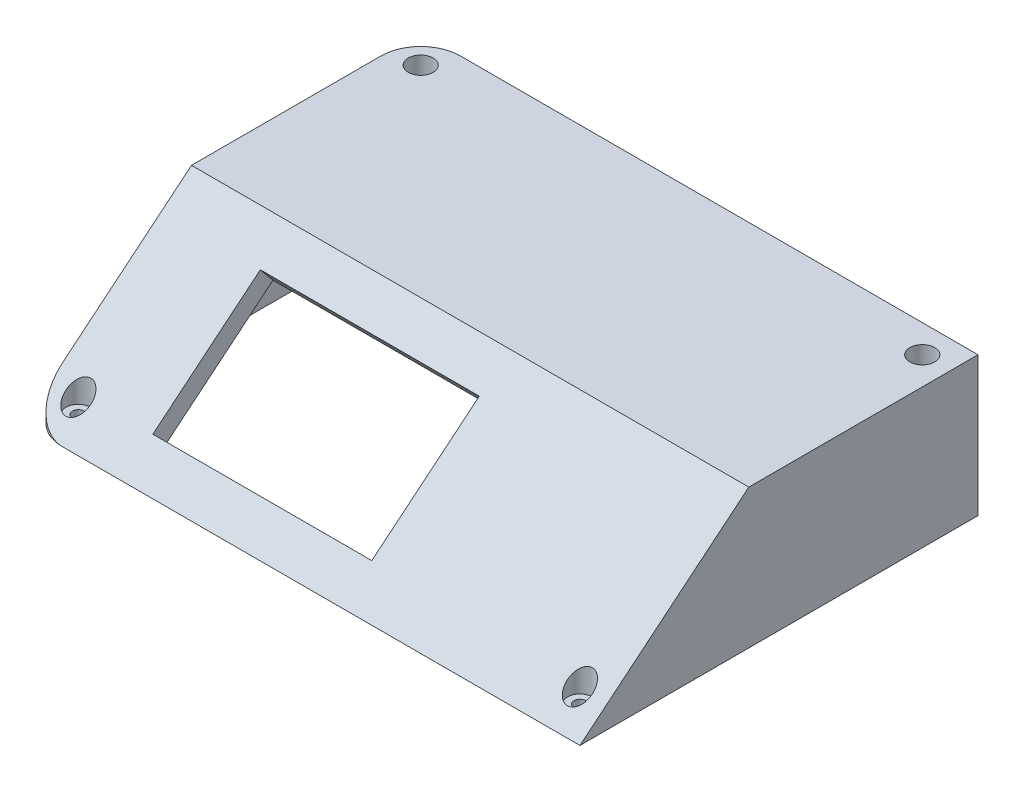
ISO-10303-21;
HEADER;
FILE_DESCRIPTION(('STEP AP214'),'2;1');
FILE_NAME('part.step','',(''),(''),'','','');
FILE_SCHEMA(('AUTOMOTIVE_DESIGN { 1 0 10303 214 1 1 1 1 }'));
ENDSEC;
DATA;
#1=APPLICATION_CONTEXT('core data for automotive mechanical design processes');
#2=APPLICATION_PROTOCOL_DEFINITION('international standard','automotive_design',2000,#1);
#3=PRODUCT_CONTEXT('',#1,'mechanical');
#4=PRODUCT('Part','Part','',(#3));
#5=PRODUCT_RELATED_PRODUCT_CATEGORY('part','',(#4));
#6=PRODUCT_DEFINITION_FORMATION('','',#4);
#7=PRODUCT_DEFINITION_CONTEXT('part definition',#1,'design');
#8=PRODUCT_DEFINITION('design','',#6,#7);
#9=PRODUCT_DEFINITION_SHAPE('','',#8);
#10=(LENGTH_UNIT() NAMED_UNIT(*) SI_UNIT(.MILLI.,.METRE.));
#11=(NAMED_UNIT(*) PLANE_ANGLE_UNIT() SI_UNIT($,.RADIAN.));
#12=(NAMED_UNIT(*) SI_UNIT($,.STERADIAN.) SOLID_ANGLE_UNIT());
#13=UNCERTAINTY_MEASURE_WITH_UNIT(LENGTH_MEASURE(1.E-05),#10,'distance_accuracy_value','');
#14=(GEOMETRIC_REPRESENTATION_CONTEXT(3) GLOBAL_UNCERTAINTY_ASSIGNED_CONTEXT((#13)) GLOBAL_UNIT_ASSIGNED_CONTEXT((#10,
#11,#12)) REPRESENTATION_CONTEXT('',''));
#15=CARTESIAN_POINT('',(0.,0.,0.));
#16=DIRECTION('',(0.,0.,1.));
#17=DIRECTION('',(1.,0.,0.));
#18=AXIS2_PLACEMENT_3D('',#15,#16,#17);
#19=CARTESIAN_POINT('',(-140.,-17.5,0.));
#20=DIRECTION('',(0.,-1.,0.));
#21=DIRECTION('',(0.,0.,-1.));
#22=AXIS2_PLACEMENT_3D('',#19,#20,#21);
#23=PLANE('',#22);
#24=CARTESIAN_POINT('',(-7.00000000000001,-17.5,-21.7867965644036));
#25=DIRECTION('',(0.,-1.,0.));
#26=DIRECTION('',(0.,0.,-1.));
#27=AXIS2_PLACEMENT_3D('',#24,#25,#26);
#28=CIRCLE('',#27,1.5);
#29=CARTESIAN_POINT('',(-7.00000000000001,-17.5,-23.2867965644036));
#30=VERTEX_POINT('',#29);
#31=EDGE_CURVE('E405',#30,#30,#28,.T.);
#32=ORIENTED_EDGE('',*,*,#31,.F.);
#33=EDGE_LOOP('',(#32));
#34=FACE_BOUND('',#33,.T.);
#35=CARTESIAN_POINT('',(-133.,-17.5,64.2132034355964));
#36=DIRECTION('',(0.,-1.,0.));
#37=DIRECTION('',(0.,0.,-1.));
#38=AXIS2_PLACEMENT_3D('',#35,#36,#37);
#39=CIRCLE('',#38,1.5);
#40=CARTESIAN_POINT('',(-133.,-17.5,62.7132034355964));
#41=VERTEX_POINT('',#40);
#42=EDGE_CURVE('E398',#41,#41,#39,.T.);
#43=ORIENTED_EDGE('',*,*,#42,.F.);
#44=EDGE_LOOP('',(#43));
#45=FACE_BOUND('',#44,.T.);
#46=DIRECTION('',(0.,0.,-1.));
#47=VECTOR('',#46,1.);
#48=CARTESIAN_POINT('',(-15.,-17.5,0.));
#49=LINE('',#48,#47);
#50=CARTESIAN_POINT('',(-15.,-17.5,-13.7867965644036));
#51=VERTEX_POINT('',#50);
#52=CARTESIAN_POINT('',(-15.,-17.5,-23.7867965644036));
#53=VERTEX_POINT('',#52);
#54=EDGE_CURVE('E219',#51,#53,#49,.T.);
#55=ORIENTED_EDGE('',*,*,#54,.T.);
#56=DIRECTION('',(-1.,0.,0.));
#57=VECTOR('',#56,1.);
#58=CARTESIAN_POINT('',(92.1622349502246,-17.5,-23.7867965644036));
#59=LINE('',#58,#57);
#60=CARTESIAN_POINT('',(-125.,-17.5,-23.7867965644036));
#61=VERTEX_POINT('',#60);
#62=EDGE_CURVE('E204',#53,#61,#59,.T.);
#63=ORIENTED_EDGE('',*,*,#62,.T.);
#64=DIRECTION('',(0.,0.,-1.));
#65=VECTOR('',#64,1.);
#66=CARTESIAN_POINT('',(-125.,-17.5,0.));
#67=LINE('',#66,#65);
#68=CARTESIAN_POINT('',(-125.,-17.5,-13.7867965644036));
#69=VERTEX_POINT('',#68);
#70=EDGE_CURVE('E231',#69,#61,#67,.T.);
#71=ORIENTED_EDGE('',*,*,#70,.F.);
#72=DIRECTION('',(1.,0.,0.));
#73=VECTOR('',#72,1.);
#74=CARTESIAN_POINT('',(0.,-17.5,-13.7867965644036));
#75=LINE('',#74,#73);
#76=CARTESIAN_POINT('',(-135.,-17.5,-13.7867965644036));
#77=VERTEX_POINT('',#76);
#78=EDGE_CURVE('E236',#77,#69,#75,.T.);
#79=ORIENTED_EDGE('',*,*,#78,.F.);
#80=DIRECTION('',(0.,0.,-1.));
#81=VECTOR('',#80,1.);
#82=CARTESIAN_POINT('',(-135.,-17.5,63.3560605784536));
#83=LINE('',#82,#81);
#84=CARTESIAN_POINT('',(-135.,-17.5,53.3560605784536));
#85=VERTEX_POINT('',#84);
#86=EDGE_CURVE('E324',#85,#77,#83,.T.);
#87=ORIENTED_EDGE('',*,*,#86,.F.);
#88=DIRECTION('',(1.,0.,0.));
#89=VECTOR('',#88,1.);
#90=CARTESIAN_POINT('',(0.,-17.5,53.3560605784536));
#91=LINE('',#90,#89);
#92=CARTESIAN_POINT('',(-125.,-17.5,53.3560605784536));
#93=VERTEX_POINT('',#92);
#94=EDGE_CURVE('E256',#85,#93,#91,.T.);
#95=ORIENTED_EDGE('',*,*,#94,.T.);
#96=DIRECTION('',(0.,0.,1.));
#97=VECTOR('',#96,1.);
#98=CARTESIAN_POINT('',(-125.,-17.5,0.));
#99=LINE('',#98,#97);
#100=CARTESIAN_POINT('',(-125.,-17.5,63.3560605784536));
#101=VERTEX_POINT('',#100);
#102=EDGE_CURVE('E262',#93,#101,#99,.T.);
#103=ORIENTED_EDGE('',*,*,#102,.T.);
#104=DIRECTION('',(-1.,0.,0.));
#105=VECTOR('',#104,1.);
#106=CARTESIAN_POINT('',(92.1622349502246,-17.5,63.3560605784536));
#107=LINE('',#106,#105);
#108=CARTESIAN_POINT('',(-15.,-17.5,63.3560605784536));
#109=VERTEX_POINT('',#108);
#110=EDGE_CURVE('E203',#109,#101,#107,.T.);
#111=ORIENTED_EDGE('',*,*,#110,.F.);
#112=DIRECTION('',(0.,0.,1.));
#113=VECTOR('',#112,1.);
#114=CARTESIAN_POINT('',(-15.,-17.5,0.));
#115=LINE('',#114,#113);
#116=CARTESIAN_POINT('',(-15.,-17.5,53.3560605784536));
#117=VERTEX_POINT('',#116);
#118=EDGE_CURVE('E250',#117,#109,#115,.T.);
#119=ORIENTED_EDGE('',*,*,#118,.F.);
#120=DIRECTION('',(-1.,0.,0.));
#121=VECTOR('',#120,1.);
#122=CARTESIAN_POINT('',(0.,-17.5,53.3560605784536));
#123=LINE('',#122,#121);
#124=CARTESIAN_POINT('',(-5.,-17.5,53.3560605784536));
#125=VERTEX_POINT('',#124);
#126=EDGE_CURVE('E199',#125,#117,#123,.T.);
#127=ORIENTED_EDGE('',*,*,#126,.F.);
#128=DIRECTION('',(0.,0.,1.));
#129=VECTOR('',#128,1.);
#130=CARTESIAN_POINT('',(-5.,-17.5,63.3560605784536));
#131=LINE('',#130,#129);
#132=CARTESIAN_POINT('',(-5.,-17.5,-13.7867965644036));
#133=VERTEX_POINT('',#132);
#134=EDGE_CURVE('E191',#133,#125,#131,.T.);
#135=ORIENTED_EDGE('',*,*,#134,.F.);
#136=DIRECTION('',(-1.,0.,0.));
#137=VECTOR('',#136,1.);
#138=CARTESIAN_POINT('',(0.,-17.5,-13.7867965644036));
#139=LINE('',#138,#137);
#140=EDGE_CURVE('E196',#133,#51,#139,.T.);
#141=ORIENTED_EDGE('',*,*,#140,.T.);
#142=EDGE_LOOP('',(#55,#63,#71,#79,#87,#95,#103,#111,#119,#127,#135,#141));
#143=FACE_BOUND('',#142,.T.);
#144=CARTESIAN_POINT('',(-130.,-17.5,61.2132034355965));
#145=DIRECTION('',(0.,1.,0.));
#146=DIRECTION('',(0.,0.,1.));
#147=AXIS2_PLACEMENT_3D('',#144,#145,#146);
#148=CIRCLE('',#147,9.99999999999997);
#149=CARTESIAN_POINT('',(-140.,-17.5,61.2132034355965));
#150=VERTEX_POINT('',#149);
#151=CARTESIAN_POINT('',(-130.,-17.5,71.2132034355964));
#152=VERTEX_POINT('',#151);
#153=EDGE_CURVE('E278',#150,#152,#148,.T.);
#154=ORIENTED_EDGE('',*,*,#153,.F.);
#155=DIRECTION('',(0.,0.,-1.));
#156=VECTOR('',#155,1.);
#157=CARTESIAN_POINT('',(-140.,-17.5,0.));
#158=LINE('',#157,#156);
#159=CARTESIAN_POINT('',(-140.,-17.5,-18.7867965644036));
#160=VERTEX_POINT('',#159);
#161=EDGE_CURVE('E337',#150,#160,#158,.T.);
#162=ORIENTED_EDGE('',*,*,#161,.T.);
#163=CARTESIAN_POINT('',(-130.,-17.5,-18.7867965644036));
#164=DIRECTION('',(0.,1.,0.));
#165=DIRECTION('',(0.,0.,-1.));
#166=AXIS2_PLACEMENT_3D('',#163,#164,#165);
#167=CIRCLE('',#166,10.);
#168=CARTESIAN_POINT('',(-130.,-17.5,-28.7867965644036));
#169=VERTEX_POINT('',#168);
#170=EDGE_CURVE('E281',#169,#160,#167,.T.);
#171=ORIENTED_EDGE('',*,*,#170,.F.);
#172=DIRECTION('',(1.,0.,0.));
#173=VECTOR('',#172,1.);
#174=CARTESIAN_POINT('',(-140.,-17.5,-28.7867965644036));
#175=LINE('',#174,#173);
#176=CARTESIAN_POINT('',(0.,-17.5,-28.7867965644036));
#177=VERTEX_POINT('',#176);
#178=EDGE_CURVE('E347',#169,#177,#175,.T.);
#179=ORIENTED_EDGE('',*,*,#178,.T.);
#180=DIRECTION('',(0.,0.,-1.));
#181=VECTOR('',#180,1.);
#182=CARTESIAN_POINT('',(0.,-17.5,0.));
#183=LINE('',#182,#181);
#184=CARTESIAN_POINT('',(0.,-17.5,71.2132034355964));
#185=VERTEX_POINT('',#184);
#186=EDGE_CURVE('E336',#185,#177,#183,.T.);
#187=ORIENTED_EDGE('',*,*,#186,.F.);
#188=DIRECTION('',(1.,0.,0.));
#189=VECTOR('',#188,1.);
#190=CARTESIAN_POINT('',(-140.,-17.5,71.2132034355964));
#191=LINE('',#190,#189);
#192=EDGE_CURVE('E49',#152,#185,#191,.T.);
#193=ORIENTED_EDGE('',*,*,#192,.F.);
#194=EDGE_LOOP('',(#154,#162,#171,#179,#187,#193));
#195=FACE_BOUND('',#194,.T.);
#196=CARTESIAN_POINT('',(-133.,-17.5,-21.7867965644036));
#197=DIRECTION('',(0.,-1.,0.));
#198=DIRECTION('',(0.,0.,-1.));
#199=AXIS2_PLACEMENT_3D('',#196,#197,#198);
#200=CIRCLE('',#199,1.5);
#201=CARTESIAN_POINT('',(-133.,-17.5,-23.2867965644036));
#202=VERTEX_POINT('',#201);
#203=EDGE_CURVE('E401',#202,#202,#200,.F.);
#204=ORIENTED_EDGE('',*,*,#203,.T.);
#205=EDGE_LOOP('',(#204));
#206=FACE_BOUND('',#205,.T.);
#207=CARTESIAN_POINT('',(-7.00000000000001,-17.5,64.2132034355964));
#208=DIRECTION('',(0.,-1.,0.));
#209=DIRECTION('',(0.,0.,-1.));
#210=AXIS2_PLACEMENT_3D('',#207,#208,#209);
#211=CIRCLE('',#210,1.5);
#212=CARTESIAN_POINT('',(-7.00000000000001,-17.5,62.7132034355964));
#213=VERTEX_POINT('',#212);
#214=EDGE_CURVE('E402',#213,#213,#211,.F.);
#215=ORIENTED_EDGE('',*,*,#214,.T.);
#216=EDGE_LOOP('',(#215));
#217=FACE_BOUND('',#216,.T.);
#218=ADVANCED_FACE('F41',(#34,#45,#143,#195,#206,#217),#23,.T.);
#219=CARTESIAN_POINT('',(-140.,24.5442023221777,20.2479338842975));
#220=DIRECTION('',(0.,0.77138921583987,0.636363636363636));
#221=DIRECTION('',(0.,-0.636363636363636,0.77138921583987));
#222=AXIS2_PLACEMENT_3D('',#219,#220,#221);
#223=PLANE('',#222);
#224=CARTESIAN_POINT('',(-133.,-11.7252946203099,64.2132034355964));
#225=DIRECTION('',(0.,0.77138921583987,0.636363636363636));
#226=DIRECTION('',(0.,0.636363636363636,-0.77138921583987));
#227=AXIS2_PLACEMENT_3D('',#224,#225,#226);
#228=ELLIPSE('',#227,4.05113260054792,3.125);
#229=CARTESIAN_POINT('',(-133.,-9.14730114723391,61.0882034355964));
#230=VERTEX_POINT('',#229);
#231=EDGE_CURVE('E223',#230,#230,#228,.F.);
#232=ORIENTED_EDGE('',*,*,#231,.T.);
#233=EDGE_LOOP('',(#232));
#234=FACE_BOUND('',#233,.T.);
#235=CARTESIAN_POINT('',(-130.,-9.25042088615696,61.2132034355965));
#236=DIRECTION('',(0.,0.77138921583987,0.636363636363636));
#237=DIRECTION('',(0.,-0.636363636363636,0.77138921583987));
#238=AXIS2_PLACEMENT_3D('',#235,#236,#237);
#239=ELLIPSE('',#238,12.9636243217533,9.99999999999997);
#240=CARTESIAN_POINT('',(-140.,-9.25042088615697,61.2132034355965));
#241=VERTEX_POINT('',#240);
#242=EDGE_CURVE('E280',#152,#241,#239,.F.);
#243=ORIENTED_EDGE('',*,*,#242,.F.);
#244=ORIENTED_EDGE('',*,*,#192,.T.);
#245=DIRECTION('',(0.,-0.636363636363636,0.77138921583987));
#246=VECTOR('',#245,1.);
#247=CARTESIAN_POINT('',(0.,24.5442023221777,20.2479338842975));
#248=LINE('',#247,#246);
#249=CARTESIAN_POINT('',(0.,17.5,28.7867965644036));
#250=VERTEX_POINT('',#249);
#251=EDGE_CURVE('E341',#250,#185,#248,.T.);
#252=ORIENTED_EDGE('',*,*,#251,.F.);
#253=DIRECTION('',(1.,0.,0.));
#254=VECTOR('',#253,1.);
#255=CARTESIAN_POINT('',(-140.,17.5,28.7867965644036));
#256=LINE('',#255,#254);
#257=CARTESIAN_POINT('',(-140.,17.5,28.7867965644036));
#258=VERTEX_POINT('',#257);
#259=EDGE_CURVE('E359',#258,#250,#256,.T.);
#260=ORIENTED_EDGE('',*,*,#259,.F.);
#261=DIRECTION('',(0.,-0.636363636363636,0.77138921583987));
#262=VECTOR('',#261,1.);
#263=CARTESIAN_POINT('',(-140.,24.5442023221777,20.2479338842975));
#264=LINE('',#263,#262);
#265=EDGE_CURVE('E344',#258,#241,#264,.T.);
#266=ORIENTED_EDGE('',*,*,#265,.T.);
#267=EDGE_LOOP('',(#243,#244,#252,#260,#266));
#268=FACE_BOUND('',#267,.T.);
#269=DIRECTION('',(0.,0.636363636363637,-0.77138921583987));
#270=VECTOR('',#269,1.);
#271=CARTESIAN_POINT('',(-60.,-11.1363636363636,63.4993112771977));
#272=LINE('',#271,#270);
#273=CARTESIAN_POINT('',(-60.,-11.1363636363636,63.4993112771977));
#274=VERTEX_POINT('',#273);
#275=CARTESIAN_POINT('',(-60.,11.1363636363636,36.5006887228023));
#276=VERTEX_POINT('',#275);
#277=EDGE_CURVE('E291',#274,#276,#272,.T.);
#278=ORIENTED_EDGE('',*,*,#277,.F.);
#279=DIRECTION('',(1.,0.,0.));
#280=VECTOR('',#279,1.);
#281=CARTESIAN_POINT('',(-115.,-11.1363636363636,63.4993112771977));
#282=LINE('',#281,#280);
#283=CARTESIAN_POINT('',(-115.,-11.1363636363636,63.4993112771977));
#284=VERTEX_POINT('',#283);
#285=EDGE_CURVE('E308',#284,#274,#282,.T.);
#286=ORIENTED_EDGE('',*,*,#285,.F.);
#287=DIRECTION('',(0.,-0.636363636363637,0.77138921583987));
#288=VECTOR('',#287,1.);
#289=CARTESIAN_POINT('',(-115.,-11.1363636363636,63.4993112771977));
#290=LINE('',#289,#288);
#291=CARTESIAN_POINT('',(-115.,11.1363636363636,36.5006887228023));
#292=VERTEX_POINT('',#291);
#293=EDGE_CURVE('E305',#292,#284,#290,.T.);
#294=ORIENTED_EDGE('',*,*,#293,.F.);
#295=DIRECTION('',(-1.,0.,0.));
#296=VECTOR('',#295,1.);
#297=CARTESIAN_POINT('',(-115.,11.1363636363636,36.5006887228023));
#298=LINE('',#297,#296);
#299=EDGE_CURVE('E302',#276,#292,#298,.T.);
#300=ORIENTED_EDGE('',*,*,#299,.F.);
#301=EDGE_LOOP('',(#278,#286,#294,#300));
#302=FACE_BOUND('',#301,.T.);
#303=CARTESIAN_POINT('',(-7.00000000000001,-11.7252946203099,64.2132034355964));
#304=DIRECTION('',(0.,0.77138921583987,0.636363636363636));
#305=DIRECTION('',(0.,0.636363636363636,-0.77138921583987));
#306=AXIS2_PLACEMENT_3D('',#303,#304,#305);
#307=ELLIPSE('',#306,4.05113260054792,3.125);
#308=CARTESIAN_POINT('',(-7.00000000000001,-9.14730114723391,61.0882034355964));
#309=VERTEX_POINT('',#308);
#310=EDGE_CURVE('E44',#309,#309,#307,.T.);
#311=ORIENTED_EDGE('',*,*,#310,.F.);
#312=EDGE_LOOP('',(#311));
#313=FACE_BOUND('',#312,.T.);
#314=ADVANCED_FACE('F437',(#234,#268,#302,#313),#223,.T.);
#315=CARTESIAN_POINT('',(-140.,17.5,0.));
#316=DIRECTION('',(0.,-1.,0.));
#317=DIRECTION('',(0.,0.,-1.));
#318=AXIS2_PLACEMENT_3D('',#315,#316,#317);
#319=PLANE('',#318);
#320=DIRECTION('',(1.,0.,0.));
#321=VECTOR('',#320,1.);
#322=CARTESIAN_POINT('',(-140.,17.5,-28.7867965644036));
#323=LINE('',#322,#321);
#324=CARTESIAN_POINT('',(-130.,17.5,-28.7867965644036));
#325=VERTEX_POINT('',#324);
#326=CARTESIAN_POINT('',(0.,17.5,-28.7867965644036));
#327=VERTEX_POINT('',#326);
#328=EDGE_CURVE('E361',#325,#327,#323,.T.);
#329=ORIENTED_EDGE('',*,*,#328,.F.);
#330=CARTESIAN_POINT('',(-130.,17.5,-18.7867965644036));
#331=DIRECTION('',(0.,1.,0.));
#332=DIRECTION('',(0.,0.,-1.));
#333=AXIS2_PLACEMENT_3D('',#330,#331,#332);
#334=CIRCLE('',#333,10.);
#335=CARTESIAN_POINT('',(-140.,17.5,-18.7867965644036));
#336=VERTEX_POINT('',#335);
#337=EDGE_CURVE('E285',#325,#336,#334,.T.);
#338=ORIENTED_EDGE('',*,*,#337,.T.);
#339=DIRECTION('',(0.,0.,-1.));
#340=VECTOR('',#339,1.);
#341=CARTESIAN_POINT('',(-140.,17.5,0.));
#342=LINE('',#341,#340);
#343=EDGE_CURVE('E340',#258,#336,#342,.T.);
#344=ORIENTED_EDGE('',*,*,#343,.F.);
#345=ORIENTED_EDGE('',*,*,#259,.T.);
#346=DIRECTION('',(0.,0.,-1.));
#347=VECTOR('',#346,1.);
#348=CARTESIAN_POINT('',(0.,17.5,0.));
#349=LINE('',#348,#347);
#350=EDGE_CURVE('E353',#250,#327,#349,.T.);
#351=ORIENTED_EDGE('',*,*,#350,.T.);
#352=EDGE_LOOP('',(#329,#338,#344,#345,#351));
#353=FACE_BOUND('',#352,.T.);
#354=CARTESIAN_POINT('',(-133.,17.5,-21.7867965644036));
#355=DIRECTION('',(0.,1.,0.));
#356=DIRECTION('',(0.,0.,1.));
#357=AXIS2_PLACEMENT_3D('',#354,#355,#356);
#358=CIRCLE('',#357,3.125);
#359=CARTESIAN_POINT('',(-133.,17.5,-18.6617965644036));
#360=VERTEX_POINT('',#359);
#361=EDGE_CURVE('E368',#360,#360,#358,.T.);
#362=ORIENTED_EDGE('',*,*,#361,.F.);
#363=EDGE_LOOP('',(#362));
#364=FACE_BOUND('',#363,.T.);
#365=CARTESIAN_POINT('',(-7.00000000000001,17.5,-21.7867965644036));
#366=DIRECTION('',(0.,1.,0.));
#367=DIRECTION('',(0.,0.,1.));
#368=AXIS2_PLACEMENT_3D('',#365,#366,#367);
#369=CIRCLE('',#368,3.125);
#370=CARTESIAN_POINT('',(-7.00000000000001,17.5,-18.6617965644036));
#371=VERTEX_POINT('',#370);
#372=EDGE_CURVE('E378',#371,#371,#369,.F.);
#373=ORIENTED_EDGE('',*,*,#372,.T.);
#374=EDGE_LOOP('',(#373));
#375=FACE_BOUND('',#374,.T.);
#376=ADVANCED_FACE('F442',(#353,#364,#375),#319,.F.);
#377=CARTESIAN_POINT('',(92.1622349502246,12.5,-23.7867965644036));
#378=DIRECTION('',(0.,1.,0.));
#379=DIRECTION('',(0.,0.,1.));
#380=AXIS2_PLACEMENT_3D('',#377,#378,#379);
#381=PLANE('',#380);
#382=DIRECTION('',(-1.,0.,0.));
#383=VECTOR('',#382,1.);
#384=CARTESIAN_POINT('',(92.1622349502246,12.5,-23.7867965644036));
#385=LINE('',#384,#383);
#386=CARTESIAN_POINT('',(-15.,12.5,-23.7867965644036));
#387=VERTEX_POINT('',#386);
#388=CARTESIAN_POINT('',(-125.,12.5,-23.7867965644036));
#389=VERTEX_POINT('',#388);
#390=EDGE_CURVE('E330',#387,#389,#385,.T.);
#391=ORIENTED_EDGE('',*,*,#390,.F.);
#392=DIRECTION('',(0.,0.,-1.));
#393=VECTOR('',#392,1.);
#394=CARTESIAN_POINT('',(-15.,12.5,0.));
#395=LINE('',#394,#393);
#396=CARTESIAN_POINT('',(-15.,12.5,-13.7867965644036));
#397=VERTEX_POINT('',#396);
#398=EDGE_CURVE('E57',#397,#387,#395,.T.);
#399=ORIENTED_EDGE('',*,*,#398,.F.);
#400=DIRECTION('',(-1.,0.,0.));
#401=VECTOR('',#400,1.);
#402=CARTESIAN_POINT('',(0.,12.5,-13.7867965644036));
#403=LINE('',#402,#401);
#404=CARTESIAN_POINT('',(-5.,12.5,-13.7867965644036));
#405=VERTEX_POINT('',#404);
#406=EDGE_CURVE('E213',#405,#397,#403,.T.);
#407=ORIENTED_EDGE('',*,*,#406,.F.);
#408=DIRECTION('',(0.,0.,-1.));
#409=VECTOR('',#408,1.);
#410=CARTESIAN_POINT('',(-5.,12.5,-23.7867965644036));
#411=LINE('',#410,#409);
#412=CARTESIAN_POINT('',(-5.,12.5,26.990568974574));
#413=VERTEX_POINT('',#412);
#414=EDGE_CURVE('E211',#413,#405,#411,.T.);
#415=ORIENTED_EDGE('',*,*,#414,.F.);
#416=DIRECTION('',(-1.,0.,0.));
#417=VECTOR('',#416,1.);
#418=CARTESIAN_POINT('',(92.1622349502246,12.5,26.990568974574));
#419=LINE('',#418,#417);
#420=CARTESIAN_POINT('',(-135.,12.5,26.990568974574));
#421=VERTEX_POINT('',#420);
#422=EDGE_CURVE('E327',#413,#421,#419,.T.);
#423=ORIENTED_EDGE('',*,*,#422,.T.);
#424=DIRECTION('',(0.,0.,1.));
#425=VECTOR('',#424,1.);
#426=CARTESIAN_POINT('',(-135.,12.5,-23.7867965644036));
#427=LINE('',#426,#425);
#428=CARTESIAN_POINT('',(-135.,12.5,-13.7867965644036));
#429=VERTEX_POINT('',#428);
#430=EDGE_CURVE('E320',#429,#421,#427,.T.);
#431=ORIENTED_EDGE('',*,*,#430,.F.);
#432=DIRECTION('',(1.,0.,0.));
#433=VECTOR('',#432,1.);
#434=CARTESIAN_POINT('',(0.,12.5,-13.7867965644036));
#435=LINE('',#434,#433);
#436=CARTESIAN_POINT('',(-125.,12.5,-13.7867965644036));
#437=VERTEX_POINT('',#436);
#438=EDGE_CURVE('E243',#429,#437,#435,.T.);
#439=ORIENTED_EDGE('',*,*,#438,.T.);
#440=DIRECTION('',(0.,0.,-1.));
#441=VECTOR('',#440,1.);
#442=CARTESIAN_POINT('',(-125.,12.5,0.));
#443=LINE('',#442,#441);
#444=EDGE_CURVE('E239',#437,#389,#443,.T.);
#445=ORIENTED_EDGE('',*,*,#444,.T.);
#446=EDGE_LOOP('',(#391,#399,#407,#415,#423,#431,#439,#445));
#447=FACE_BOUND('',#446,.T.);
#448=ADVANCED_FACE('F533',(#447),#381,.F.);
#449=CARTESIAN_POINT('',(92.1622349502246,-17.5,-23.7867965644036));
#450=DIRECTION('',(0.,0.,-1.));
#451=DIRECTION('',(-1.,0.,0.));
#452=AXIS2_PLACEMENT_3D('',#449,#450,#451);
#453=PLANE('',#452);
#454=ORIENTED_EDGE('',*,*,#62,.F.);
#455=DIRECTION('',(0.,-1.,0.));
#456=VECTOR('',#455,1.);
#457=CARTESIAN_POINT('',(-15.,26.642135623731,-23.7867965644036));
#458=LINE('',#457,#456);
#459=EDGE_CURVE('E65',#387,#53,#458,.T.);
#460=ORIENTED_EDGE('',*,*,#459,.F.);
#461=ORIENTED_EDGE('',*,*,#390,.T.);
#462=DIRECTION('',(0.,-1.,0.));
#463=VECTOR('',#462,1.);
#464=CARTESIAN_POINT('',(-125.,26.642135623731,-23.7867965644036));
#465=LINE('',#464,#463);
#466=EDGE_CURVE('E234',#389,#61,#465,.T.);
#467=ORIENTED_EDGE('',*,*,#466,.T.);
#468=EDGE_LOOP('',(#454,#460,#461,#467));
#469=FACE_BOUND('',#468,.T.);
#470=ADVANCED_FACE('F529',(#469),#453,.F.);
#471=CARTESIAN_POINT('',(-135.,0.,0.));
#472=DIRECTION('',(1.,0.,0.));
#473=DIRECTION('',(0.,0.,-1.));
#474=AXIS2_PLACEMENT_3D('',#471,#472,#473);
#475=PLANE('',#474);
#476=ORIENTED_EDGE('',*,*,#86,.T.);
#477=DIRECTION('',(0.,-1.,0.));
#478=VECTOR('',#477,1.);
#479=CARTESIAN_POINT('',(-135.,26.642135623731,-13.7867965644036));
#480=LINE('',#479,#478);
#481=EDGE_CURVE('E230',#429,#77,#480,.T.);
#482=ORIENTED_EDGE('',*,*,#481,.F.);
#483=ORIENTED_EDGE('',*,*,#430,.T.);
#484=DIRECTION('',(0.,-0.636363636363637,0.77138921583987));
#485=VECTOR('',#484,1.);
#486=CARTESIAN_POINT('',(-135.,12.5,26.990568974574));
#487=LINE('',#486,#485);
#488=CARTESIAN_POINT('',(-135.,-9.25042088615696,53.3560605784536));
#489=VERTEX_POINT('',#488);
#490=EDGE_CURVE('E322',#421,#489,#487,.T.);
#491=ORIENTED_EDGE('',*,*,#490,.T.);
#492=DIRECTION('',(0.,-1.,0.));
#493=VECTOR('',#492,1.);
#494=CARTESIAN_POINT('',(-135.,2.86252403545367,53.3560605784536));
#495=LINE('',#494,#493);
#496=EDGE_CURVE('E272',#489,#85,#495,.T.);
#497=ORIENTED_EDGE('',*,*,#496,.T.);
#498=EDGE_LOOP('',(#476,#482,#483,#491,#497));
#499=FACE_BOUND('',#498,.T.);
#500=ADVANCED_FACE('F526',(#499),#475,.T.);
#501=CARTESIAN_POINT('',(-5.,0.,0.));
#502=DIRECTION('',(1.,0.,0.));
#503=DIRECTION('',(0.,0.,-1.));
#504=AXIS2_PLACEMENT_3D('',#501,#502,#503);
#505=PLANE('',#504);
#506=ORIENTED_EDGE('',*,*,#414,.T.);
#507=DIRECTION('',(0.,-1.,0.));
#508=VECTOR('',#507,1.);
#509=CARTESIAN_POINT('',(-5.,26.642135623731,-13.7867965644036));
#510=LINE('',#509,#508);
#511=EDGE_CURVE('E208',#405,#133,#510,.T.);
#512=ORIENTED_EDGE('',*,*,#511,.T.);
#513=ORIENTED_EDGE('',*,*,#134,.T.);
#514=DIRECTION('',(0.,-1.,0.));
#515=VECTOR('',#514,1.);
#516=CARTESIAN_POINT('',(-5.,2.86252403545367,53.3560605784536));
#517=LINE('',#516,#515);
#518=CARTESIAN_POINT('',(-5.,-9.25042088615696,53.3560605784536));
#519=VERTEX_POINT('',#518);
#520=EDGE_CURVE('E253',#519,#125,#517,.T.);
#521=ORIENTED_EDGE('',*,*,#520,.F.);
#522=DIRECTION('',(0.,0.636363636363637,-0.77138921583987));
#523=VECTOR('',#522,1.);
#524=CARTESIAN_POINT('',(-5.,12.5,26.990568974574));
#525=LINE('',#524,#523);
#526=EDGE_CURVE('E326',#519,#413,#525,.T.);
#527=ORIENTED_EDGE('',*,*,#526,.T.);
#528=EDGE_LOOP('',(#506,#512,#513,#521,#527));
#529=FACE_BOUND('',#528,.T.);
#530=ADVANCED_FACE('F209',(#529),#505,.F.);
#531=CARTESIAN_POINT('',(92.1622349502246,12.5,26.990568974574));
#532=DIRECTION('',(0.,0.77138921583987,0.636363636363636));
#533=DIRECTION('',(0.,-0.636363636363637,0.77138921583987));
#534=AXIS2_PLACEMENT_3D('',#531,#532,#533);
#535=PLANE('',#534);
#536=DIRECTION('',(-1.,0.,0.));
#537=VECTOR('',#536,1.);
#538=CARTESIAN_POINT('',(-115.,-14.993309715563,60.3174930953795));
#539=LINE('',#538,#537);
#540=CARTESIAN_POINT('',(-60.,-14.993309715563,60.3174930953795));
#541=VERTEX_POINT('',#540);
#542=CARTESIAN_POINT('',(-115.,-14.993309715563,60.3174930953795));
#543=VERTEX_POINT('',#542);
#544=EDGE_CURVE('E295',#541,#543,#539,.T.);
#545=ORIENTED_EDGE('',*,*,#544,.F.);
#546=DIRECTION('',(0.,-0.636363636363637,0.77138921583987));
#547=VECTOR('',#546,1.);
#548=CARTESIAN_POINT('',(-60.,-14.993309715563,60.3174930953795));
#549=LINE('',#548,#547);
#550=CARTESIAN_POINT('',(-60.,7.27941755716428,33.3188705409841));
#551=VERTEX_POINT('',#550);
#552=EDGE_CURVE('E298',#551,#541,#549,.T.);
#553=ORIENTED_EDGE('',*,*,#552,.F.);
#554=DIRECTION('',(1.,0.,0.));
#555=VECTOR('',#554,1.);
#556=CARTESIAN_POINT('',(-115.,7.27941755716428,33.3188705409841));
#557=LINE('',#556,#555);
#558=CARTESIAN_POINT('',(-115.,7.27941755716429,33.3188705409841));
#559=VERTEX_POINT('',#558);
#560=EDGE_CURVE('E300',#559,#551,#557,.T.);
#561=ORIENTED_EDGE('',*,*,#560,.F.);
#562=DIRECTION('',(0.,0.636363636363637,-0.77138921583987));
#563=VECTOR('',#562,1.);
#564=CARTESIAN_POINT('',(-115.,-14.993309715563,60.3174930953795));
#565=LINE('',#564,#563);
#566=EDGE_CURVE('E292',#543,#559,#565,.T.);
#567=ORIENTED_EDGE('',*,*,#566,.F.);
#568=EDGE_LOOP('',(#545,#553,#561,#567));
#569=FACE_BOUND('',#568,.T.);
#570=DIRECTION('',(0.,-0.636363636363637,0.77138921583987));
#571=VECTOR('',#570,1.);
#572=CARTESIAN_POINT('',(-15.,21.8464601912199,15.6609483209139));
#573=LINE('',#572,#571);
#574=CARTESIAN_POINT('',(-15.,-9.25042088615695,53.3560605784536));
#575=VERTEX_POINT('',#574);
#576=EDGE_CURVE('E257',#575,#109,#573,.T.);
#577=ORIENTED_EDGE('',*,*,#576,.T.);
#578=ORIENTED_EDGE('',*,*,#110,.T.);
#579=DIRECTION('',(0.,-0.636363636363637,0.77138921583987));
#580=VECTOR('',#579,1.);
#581=CARTESIAN_POINT('',(-125.,21.8464601912199,15.6609483209139));
#582=LINE('',#581,#580);
#583=CARTESIAN_POINT('',(-125.,-9.25042088615695,53.3560605784536));
#584=VERTEX_POINT('',#583);
#585=EDGE_CURVE('E265',#584,#101,#582,.T.);
#586=ORIENTED_EDGE('',*,*,#585,.F.);
#587=DIRECTION('',(1.,0.,0.));
#588=VECTOR('',#587,1.);
#589=CARTESIAN_POINT('',(0.,-9.25042088615695,53.3560605784536));
#590=LINE('',#589,#588);
#591=EDGE_CURVE('E268',#489,#584,#590,.T.);
#592=ORIENTED_EDGE('',*,*,#591,.F.);
#593=ORIENTED_EDGE('',*,*,#490,.F.);
#594=ORIENTED_EDGE('',*,*,#422,.F.);
#595=ORIENTED_EDGE('',*,*,#526,.F.);
#596=DIRECTION('',(-1.,0.,0.));
#597=VECTOR('',#596,1.);
#598=CARTESIAN_POINT('',(0.,-9.25042088615695,53.3560605784536));
#599=LINE('',#598,#597);
#600=EDGE_CURVE('E242',#519,#575,#599,.T.);
#601=ORIENTED_EDGE('',*,*,#600,.T.);
#602=EDGE_LOOP('',(#577,#578,#586,#592,#593,#594,#595,#601));
#603=FACE_BOUND('',#602,.T.);
#604=ADVANCED_FACE('F536',(#569,#603),#535,.F.);
#605=CARTESIAN_POINT('',(-140.,0.,-28.7867965644036));
#606=DIRECTION('',(0.,0.,-1.));
#607=DIRECTION('',(0.,1.,0.));
#608=AXIS2_PLACEMENT_3D('',#605,#606,#607);
#609=PLANE('',#608);
#610=ORIENTED_EDGE('',*,*,#178,.F.);
#611=DIRECTION('',(0.,-1.,0.));
#612=VECTOR('',#611,1.);
#613=CARTESIAN_POINT('',(-130.,17.5,-28.7867965644036));
#614=LINE('',#613,#612);
#615=EDGE_CURVE('E277',#325,#169,#614,.T.);
#616=ORIENTED_EDGE('',*,*,#615,.F.);
#617=ORIENTED_EDGE('',*,*,#328,.T.);
#618=DIRECTION('',(0.,1.,0.));
#619=VECTOR('',#618,1.);
#620=CARTESIAN_POINT('',(0.,0.,-28.7867965644036));
#621=LINE('',#620,#619);
#622=EDGE_CURVE('E350',#177,#327,#621,.T.);
#623=ORIENTED_EDGE('',*,*,#622,.F.);
#624=EDGE_LOOP('',(#610,#616,#617,#623));
#625=FACE_BOUND('',#624,.T.);
#626=ADVANCED_FACE('F539',(#625),#609,.T.);
#627=CARTESIAN_POINT('',(-140.,0.,0.));
#628=DIRECTION('',(1.,0.,0.));
#629=DIRECTION('',(0.,0.,-1.));
#630=AXIS2_PLACEMENT_3D('',#627,#628,#629);
#631=PLANE('',#630);
#632=ORIENTED_EDGE('',*,*,#161,.F.);
#633=DIRECTION('',(0.,-1.,0.));
#634=VECTOR('',#633,1.);
#635=CARTESIAN_POINT('',(-140.,17.5,61.2132034355965));
#636=LINE('',#635,#634);
#637=EDGE_CURVE('E12',#150,#241,#636,.F.);
#638=ORIENTED_EDGE('',*,*,#637,.T.);
#639=ORIENTED_EDGE('',*,*,#265,.F.);
#640=ORIENTED_EDGE('',*,*,#343,.T.);
#641=DIRECTION('',(0.,-1.,0.));
#642=VECTOR('',#641,1.);
#643=CARTESIAN_POINT('',(-140.,17.5,-18.7867965644036));
#644=LINE('',#643,#642);
#645=EDGE_CURVE('E282',#336,#160,#644,.T.);
#646=ORIENTED_EDGE('',*,*,#645,.T.);
#647=EDGE_LOOP('',(#632,#638,#639,#640,#646));
#648=FACE_BOUND('',#647,.T.);
#649=ADVANCED_FACE('F543',(#648),#631,.F.);
#650=CARTESIAN_POINT('',(0.,0.,0.));
#651=DIRECTION('',(1.,0.,0.));
#652=DIRECTION('',(0.,0.,-1.));
#653=AXIS2_PLACEMENT_3D('',#650,#651,#652);
#654=PLANE('',#653);
#655=ORIENTED_EDGE('',*,*,#186,.T.);
#656=ORIENTED_EDGE('',*,*,#622,.T.);
#657=ORIENTED_EDGE('',*,*,#350,.F.);
#658=ORIENTED_EDGE('',*,*,#251,.T.);
#659=EDGE_LOOP('',(#655,#656,#657,#658));
#660=FACE_BOUND('',#659,.T.);
#661=ADVANCED_FACE('F524',(#660),#654,.T.);
#662=CARTESIAN_POINT('',(-60.,-65.2817340280696,18.8316596077263));
#663=DIRECTION('',(1.,0.,0.));
#664=DIRECTION('',(0.,0.,-1.));
#665=AXIS2_PLACEMENT_3D('',#662,#663,#664);
#666=PLANE('',#665);
#667=ORIENTED_EDGE('',*,*,#552,.T.);
#668=DIRECTION('',(0.,0.77138921583987,0.636363636363636));
#669=VECTOR('',#668,1.);
#670=CARTESIAN_POINT('',(-60.,-65.2817340280696,18.8316596077263));
#671=LINE('',#670,#669);
#672=EDGE_CURVE('E296',#541,#274,#671,.T.);
#673=ORIENTED_EDGE('',*,*,#672,.T.);
#674=ORIENTED_EDGE('',*,*,#277,.T.);
#675=DIRECTION('',(0.,0.77138921583987,0.636363636363636));
#676=VECTOR('',#675,1.);
#677=CARTESIAN_POINT('',(-60.,-43.0090067553424,-8.16696294666914));
#678=LINE('',#677,#676);
#679=EDGE_CURVE('E311',#551,#276,#678,.T.);
#680=ORIENTED_EDGE('',*,*,#679,.F.);
#681=EDGE_LOOP('',(#667,#673,#674,#680));
#682=FACE_BOUND('',#681,.T.);
#683=ADVANCED_FACE('F514',(#682),#666,.F.);
#684=CARTESIAN_POINT('',(-115.,-65.2817340280696,18.8316596077263));
#685=DIRECTION('',(0.,-0.636363636363636,0.77138921583987));
#686=DIRECTION('',(0.,-0.77138921583987,-0.636363636363636));
#687=AXIS2_PLACEMENT_3D('',#684,#685,#686);
#688=PLANE('',#687);
#689=ORIENTED_EDGE('',*,*,#544,.T.);
#690=DIRECTION('',(0.,0.77138921583987,0.636363636363636));
#691=VECTOR('',#690,1.);
#692=CARTESIAN_POINT('',(-115.,-65.2817340280696,18.8316596077263));
#693=LINE('',#692,#691);
#694=EDGE_CURVE('E313',#543,#284,#693,.T.);
#695=ORIENTED_EDGE('',*,*,#694,.T.);
#696=ORIENTED_EDGE('',*,*,#285,.T.);
#697=ORIENTED_EDGE('',*,*,#672,.F.);
#698=EDGE_LOOP('',(#689,#695,#696,#697));
#699=FACE_BOUND('',#698,.T.);
#700=ADVANCED_FACE('F510',(#699),#688,.F.);
#701=CARTESIAN_POINT('',(-115.,-65.2817340280696,18.8316596077263));
#702=DIRECTION('',(-1.,0.,0.));
#703=DIRECTION('',(0.,0.,1.));
#704=AXIS2_PLACEMENT_3D('',#701,#702,#703);
#705=PLANE('',#704);
#706=ORIENTED_EDGE('',*,*,#566,.T.);
#707=DIRECTION('',(0.,0.77138921583987,0.636363636363636));
#708=VECTOR('',#707,1.);
#709=CARTESIAN_POINT('',(-115.,-43.0090067553424,-8.16696294666914));
#710=LINE('',#709,#708);
#711=EDGE_CURVE('E315',#559,#292,#710,.T.);
#712=ORIENTED_EDGE('',*,*,#711,.T.);
#713=ORIENTED_EDGE('',*,*,#293,.T.);
#714=ORIENTED_EDGE('',*,*,#694,.F.);
#715=EDGE_LOOP('',(#706,#712,#713,#714));
#716=FACE_BOUND('',#715,.T.);
#717=ADVANCED_FACE('F513',(#716),#705,.F.);
#718=CARTESIAN_POINT('',(-115.,-43.0090067553424,-8.16696294666914));
#719=DIRECTION('',(0.,0.636363636363636,-0.77138921583987));
#720=DIRECTION('',(0.,0.77138921583987,0.636363636363636));
#721=AXIS2_PLACEMENT_3D('',#718,#719,#720);
#722=PLANE('',#721);
#723=ORIENTED_EDGE('',*,*,#560,.T.);
#724=ORIENTED_EDGE('',*,*,#679,.T.);
#725=ORIENTED_EDGE('',*,*,#299,.T.);
#726=ORIENTED_EDGE('',*,*,#711,.F.);
#727=EDGE_LOOP('',(#723,#724,#725,#726));
#728=FACE_BOUND('',#727,.T.);
#729=ADVANCED_FACE('F508',(#728),#722,.F.);
#730=CARTESIAN_POINT('',(-130.,17.5,-18.7867965644036));
#731=DIRECTION('',(0.,-1.,0.));
#732=DIRECTION('',(0.,0.,-1.));
#733=AXIS2_PLACEMENT_3D('',#730,#731,#732);
#734=CYLINDRICAL_SURFACE('',#733,10.);
#735=ORIENTED_EDGE('',*,*,#170,.T.);
#736=ORIENTED_EDGE('',*,*,#645,.F.);
#737=ORIENTED_EDGE('',*,*,#337,.F.);
#738=ORIENTED_EDGE('',*,*,#615,.T.);
#739=EDGE_LOOP('',(#735,#736,#737,#738));
#740=FACE_BOUND('',#739,.T.);
#741=ADVANCED_FACE('F504',(#740),#734,.T.);
#742=CARTESIAN_POINT('',(-130.,17.5,61.2132034355965));
#743=DIRECTION('',(0.,-1.,0.));
#744=DIRECTION('',(0.,0.,-1.));
#745=AXIS2_PLACEMENT_3D('',#742,#743,#744);
#746=CYLINDRICAL_SURFACE('',#745,9.99999999999997);
#747=ORIENTED_EDGE('',*,*,#242,.T.);
#748=ORIENTED_EDGE('',*,*,#637,.F.);
#749=ORIENTED_EDGE('',*,*,#153,.T.);
#750=EDGE_LOOP('',(#747,#748,#749));
#751=FACE_BOUND('',#750,.T.);
#752=ADVANCED_FACE('F500',(#751),#746,.T.);
#753=CARTESIAN_POINT('',(-125.,2.86252403545367,0.));
#754=DIRECTION('',(1.,0.,0.));
#755=DIRECTION('',(0.,0.,-1.));
#756=AXIS2_PLACEMENT_3D('',#753,#754,#755);
#757=PLANE('',#756);
#758=DIRECTION('',(0.,-1.,0.));
#759=VECTOR('',#758,1.);
#760=CARTESIAN_POINT('',(-125.,2.86252403545367,53.3560605784536));
#761=LINE('',#760,#759);
#762=EDGE_CURVE('E271',#584,#93,#761,.T.);
#763=ORIENTED_EDGE('',*,*,#762,.F.);
#764=ORIENTED_EDGE('',*,*,#585,.T.);
#765=ORIENTED_EDGE('',*,*,#102,.F.);
#766=EDGE_LOOP('',(#763,#764,#765));
#767=FACE_BOUND('',#766,.T.);
#768=ADVANCED_FACE('F496',(#767),#757,.T.);
#769=CARTESIAN_POINT('',(0.,2.86252403545367,53.3560605784536));
#770=DIRECTION('',(0.,0.,-1.));
#771=DIRECTION('',(-1.,0.,0.));
#772=AXIS2_PLACEMENT_3D('',#769,#770,#771);
#773=PLANE('',#772);
#774=ORIENTED_EDGE('',*,*,#496,.F.);
#775=ORIENTED_EDGE('',*,*,#591,.T.);
#776=ORIENTED_EDGE('',*,*,#762,.T.);
#777=ORIENTED_EDGE('',*,*,#94,.F.);
#778=EDGE_LOOP('',(#774,#775,#776,#777));
#779=FACE_BOUND('',#778,.T.);
#780=ADVANCED_FACE('F492',(#779),#773,.T.);
#781=CARTESIAN_POINT('',(-15.,2.86252403545367,0.));
#782=DIRECTION('',(1.,0.,0.));
#783=DIRECTION('',(0.,0.,-1.));
#784=AXIS2_PLACEMENT_3D('',#781,#782,#783);
#785=PLANE('',#784);
#786=ORIENTED_EDGE('',*,*,#576,.F.);
#787=DIRECTION('',(0.,-1.,0.));
#788=VECTOR('',#787,1.);
#789=CARTESIAN_POINT('',(-15.,2.86252403545367,53.3560605784536));
#790=LINE('',#789,#788);
#791=EDGE_CURVE('E254',#575,#117,#790,.T.);
#792=ORIENTED_EDGE('',*,*,#791,.T.);
#793=ORIENTED_EDGE('',*,*,#118,.T.);
#794=EDGE_LOOP('',(#786,#792,#793));
#795=FACE_BOUND('',#794,.T.);
#796=ADVANCED_FACE('F488',(#795),#785,.F.);
#797=CARTESIAN_POINT('',(0.,2.86252403545367,53.3560605784536));
#798=DIRECTION('',(0.,0.,1.));
#799=DIRECTION('',(1.,0.,0.));
#800=AXIS2_PLACEMENT_3D('',#797,#798,#799);
#801=PLANE('',#800);
#802=ORIENTED_EDGE('',*,*,#600,.F.);
#803=ORIENTED_EDGE('',*,*,#520,.T.);
#804=ORIENTED_EDGE('',*,*,#126,.T.);
#805=ORIENTED_EDGE('',*,*,#791,.F.);
#806=EDGE_LOOP('',(#802,#803,#804,#805));
#807=FACE_BOUND('',#806,.T.);
#808=ADVANCED_FACE('F484',(#807),#801,.F.);
#809=CARTESIAN_POINT('',(0.,26.642135623731,-13.7867965644036));
#810=DIRECTION('',(0.,0.,-1.));
#811=DIRECTION('',(-1.,0.,0.));
#812=AXIS2_PLACEMENT_3D('',#809,#810,#811);
#813=PLANE('',#812);
#814=ORIENTED_EDGE('',*,*,#438,.F.);
#815=ORIENTED_EDGE('',*,*,#481,.T.);
#816=ORIENTED_EDGE('',*,*,#78,.T.);
#817=DIRECTION('',(0.,-1.,0.));
#818=VECTOR('',#817,1.);
#819=CARTESIAN_POINT('',(-125.,26.642135623731,-13.7867965644036));
#820=LINE('',#819,#818);
#821=EDGE_CURVE('E235',#437,#69,#820,.T.);
#822=ORIENTED_EDGE('',*,*,#821,.F.);
#823=EDGE_LOOP('',(#814,#815,#816,#822));
#824=FACE_BOUND('',#823,.T.);
#825=ADVANCED_FACE('F480',(#824),#813,.F.);
#826=CARTESIAN_POINT('',(-125.,26.642135623731,0.));
#827=DIRECTION('',(-1.,0.,0.));
#828=DIRECTION('',(0.,0.,1.));
#829=AXIS2_PLACEMENT_3D('',#826,#827,#828);
#830=PLANE('',#829);
#831=ORIENTED_EDGE('',*,*,#444,.F.);
#832=ORIENTED_EDGE('',*,*,#821,.T.);
#833=ORIENTED_EDGE('',*,*,#70,.T.);
#834=ORIENTED_EDGE('',*,*,#466,.F.);
#835=EDGE_LOOP('',(#831,#832,#833,#834));
#836=FACE_BOUND('',#835,.T.);
#837=ADVANCED_FACE('F476',(#836),#830,.F.);
#838=CARTESIAN_POINT('',(-15.,26.642135623731,0.));
#839=DIRECTION('',(-1.,0.,0.));
#840=DIRECTION('',(0.,0.,1.));
#841=AXIS2_PLACEMENT_3D('',#838,#839,#840);
#842=PLANE('',#841);
#843=DIRECTION('',(0.,-1.,0.));
#844=VECTOR('',#843,1.);
#845=CARTESIAN_POINT('',(-15.,26.642135623731,-13.7867965644036));
#846=LINE('',#845,#844);
#847=EDGE_CURVE('E217',#397,#51,#846,.T.);
#848=ORIENTED_EDGE('',*,*,#847,.F.);
#849=ORIENTED_EDGE('',*,*,#398,.T.);
#850=ORIENTED_EDGE('',*,*,#459,.T.);
#851=ORIENTED_EDGE('',*,*,#54,.F.);
#852=EDGE_LOOP('',(#848,#849,#850,#851));
#853=FACE_BOUND('',#852,.T.);
#854=ADVANCED_FACE('F473',(#853),#842,.T.);
#855=CARTESIAN_POINT('',(0.,26.642135623731,-13.7867965644036));
#856=DIRECTION('',(0.,0.,1.));
#857=DIRECTION('',(1.,0.,0.));
#858=AXIS2_PLACEMENT_3D('',#855,#856,#857);
#859=PLANE('',#858);
#860=ORIENTED_EDGE('',*,*,#511,.F.);
#861=ORIENTED_EDGE('',*,*,#406,.T.);
#862=ORIENTED_EDGE('',*,*,#847,.T.);
#863=ORIENTED_EDGE('',*,*,#140,.F.);
#864=EDGE_LOOP('',(#860,#861,#862,#863));
#865=FACE_BOUND('',#864,.T.);
#866=ADVANCED_FACE('F215',(#865),#859,.T.);
#867=CARTESIAN_POINT('',(-133.,-26.3388347648318,-21.7867965644036));
#868=DIRECTION('',(0.,1.,0.));
#869=DIRECTION('',(0.,0.,1.));
#870=AXIS2_PLACEMENT_3D('',#867,#868,#869);
#871=CYLINDRICAL_SURFACE('',#870,3.125);
#872=ORIENTED_EDGE('',*,*,#361,.T.);
#873=EDGE_LOOP('',(#872));
#874=FACE_BOUND('',#873,.T.);
#875=CARTESIAN_POINT('',(-133.,-15.5,-21.7867965644036));
#876=DIRECTION('',(0.,-1.,0.));
#877=DIRECTION('',(0.,0.,-1.));
#878=AXIS2_PLACEMENT_3D('',#875,#876,#877);
#879=CIRCLE('',#878,3.125);
#880=CARTESIAN_POINT('',(-133.,-15.5,-24.9117965644036));
#881=VERTEX_POINT('',#880);
#882=EDGE_CURVE('E372',#881,#881,#879,.F.);
#883=ORIENTED_EDGE('',*,*,#882,.F.);
#884=EDGE_LOOP('',(#883));
#885=FACE_BOUND('',#884,.T.);
#886=ADVANCED_FACE('F423',(#874,#885),#871,.F.);
#887=CARTESIAN_POINT('',(-140.,-15.5,0.));
#888=DIRECTION('',(0.,-1.,0.));
#889=DIRECTION('',(0.,0.,-1.));
#890=AXIS2_PLACEMENT_3D('',#887,#888,#889);
#891=PLANE('',#890);
#892=ORIENTED_EDGE('',*,*,#882,.T.);
#893=EDGE_LOOP('',(#892));
#894=FACE_BOUND('',#893,.T.);
#895=CARTESIAN_POINT('',(-133.,-15.5,-21.7867965644036));
#896=DIRECTION('',(0.,-1.,0.));
#897=DIRECTION('',(0.,0.,-1.));
#898=AXIS2_PLACEMENT_3D('',#895,#896,#897);
#899=CIRCLE('',#898,1.5);
#900=CARTESIAN_POINT('',(-133.,-15.5,-23.2867965644036));
#901=VERTEX_POINT('',#900);
#902=EDGE_CURVE('E379',#901,#901,#899,.T.);
#903=ORIENTED_EDGE('',*,*,#902,.T.);
#904=EDGE_LOOP('',(#903));
#905=FACE_BOUND('',#904,.T.);
#906=ADVANCED_FACE('F420',(#894,#905),#891,.F.);
#907=CARTESIAN_POINT('',(-7.00000000000001,-26.3388347648318,-21.7867965644036));
#908=DIRECTION('',(0.,1.,0.));
#909=DIRECTION('',(0.,0.,1.));
#910=AXIS2_PLACEMENT_3D('',#907,#908,#909);
#911=CYLINDRICAL_SURFACE('',#910,3.125);
#912=ORIENTED_EDGE('',*,*,#372,.F.);
#913=EDGE_LOOP('',(#912));
#914=FACE_BOUND('',#913,.T.);
#915=CARTESIAN_POINT('',(-7.00000000000001,-15.5,-21.7867965644036));
#916=DIRECTION('',(0.,-1.,0.));
#917=DIRECTION('',(0.,0.,-1.));
#918=AXIS2_PLACEMENT_3D('',#915,#916,#917);
#919=CIRCLE('',#918,3.125);
#920=CARTESIAN_POINT('',(-7.00000000000001,-15.5,-24.9117965644036));
#921=VERTEX_POINT('',#920);
#922=EDGE_CURVE('E382',#921,#921,#919,.T.);
#923=ORIENTED_EDGE('',*,*,#922,.T.);
#924=EDGE_LOOP('',(#923));
#925=FACE_BOUND('',#924,.T.);
#926=ADVANCED_FACE('F422',(#914,#925),#911,.F.);
#927=CARTESIAN_POINT('',(-140.,-15.5,0.));
#928=DIRECTION('',(0.,-1.,0.));
#929=DIRECTION('',(0.,0.,-1.));
#930=AXIS2_PLACEMENT_3D('',#927,#928,#929);
#931=PLANE('',#930);
#932=CARTESIAN_POINT('',(-7.00000000000001,-15.5,-21.7867965644036));
#933=DIRECTION('',(0.,-1.,0.));
#934=DIRECTION('',(0.,0.,-1.));
#935=AXIS2_PLACEMENT_3D('',#932,#933,#934);
#936=CIRCLE('',#935,1.5);
#937=CARTESIAN_POINT('',(-7.00000000000001,-15.5,-23.2867965644036));
#938=VERTEX_POINT('',#937);
#939=EDGE_CURVE('E392',#938,#938,#936,.F.);
#940=ORIENTED_EDGE('',*,*,#939,.F.);
#941=EDGE_LOOP('',(#940));
#942=FACE_BOUND('',#941,.T.);
#943=ORIENTED_EDGE('',*,*,#922,.F.);
#944=EDGE_LOOP('',(#943));
#945=FACE_BOUND('',#944,.T.);
#946=ADVANCED_FACE('F430',(#942,#945),#931,.F.);
#947=CARTESIAN_POINT('',(-133.,-26.3388347648318,64.2132034355964));
#948=DIRECTION('',(0.,1.,0.));
#949=DIRECTION('',(0.,0.,1.));
#950=AXIS2_PLACEMENT_3D('',#947,#948,#949);
#951=CYLINDRICAL_SURFACE('',#950,3.125);
#952=ORIENTED_EDGE('',*,*,#231,.F.);
#953=EDGE_LOOP('',(#952));
#954=FACE_BOUND('',#953,.T.);
#955=CARTESIAN_POINT('',(-133.,-15.5,64.2132034355964));
#956=DIRECTION('',(0.,-1.,0.));
#957=DIRECTION('',(0.,0.,-1.));
#958=AXIS2_PLACEMENT_3D('',#955,#956,#957);
#959=CIRCLE('',#958,3.125);
#960=CARTESIAN_POINT('',(-133.,-15.5,61.0882034355964));
#961=VERTEX_POINT('',#960);
#962=EDGE_CURVE('E364',#961,#961,#959,.T.);
#963=ORIENTED_EDGE('',*,*,#962,.T.);
#964=EDGE_LOOP('',(#963));
#965=FACE_BOUND('',#964,.T.);
#966=ADVANCED_FACE('F458',(#954,#965),#951,.F.);
#967=CARTESIAN_POINT('',(-140.,-15.5,0.));
#968=DIRECTION('',(0.,-1.,0.));
#969=DIRECTION('',(0.,0.,-1.));
#970=AXIS2_PLACEMENT_3D('',#967,#968,#969);
#971=PLANE('',#970);
#972=CARTESIAN_POINT('',(-133.,-15.5,64.2132034355964));
#973=DIRECTION('',(0.,-1.,0.));
#974=DIRECTION('',(0.,0.,-1.));
#975=AXIS2_PLACEMENT_3D('',#972,#973,#974);
#976=CIRCLE('',#975,1.5);
#977=CARTESIAN_POINT('',(-133.,-15.5,62.7132034355964));
#978=VERTEX_POINT('',#977);
#979=EDGE_CURVE('E395',#978,#978,#976,.F.);
#980=ORIENTED_EDGE('',*,*,#979,.F.);
#981=EDGE_LOOP('',(#980));
#982=FACE_BOUND('',#981,.T.);
#983=ORIENTED_EDGE('',*,*,#962,.F.);
#984=EDGE_LOOP('',(#983));
#985=FACE_BOUND('',#984,.T.);
#986=ADVANCED_FACE('F454',(#982,#985),#971,.F.);
#987=CARTESIAN_POINT('',(-7.00000000000001,-26.3388347648318,64.2132034355964));
#988=DIRECTION('',(0.,1.,0.));
#989=DIRECTION('',(0.,0.,1.));
#990=AXIS2_PLACEMENT_3D('',#987,#988,#989);
#991=CYLINDRICAL_SURFACE('',#990,3.125);
#992=ORIENTED_EDGE('',*,*,#310,.T.);
#993=EDGE_LOOP('',(#992));
#994=FACE_BOUND('',#993,.T.);
#995=CARTESIAN_POINT('',(-7.00000000000001,-15.5,64.2132034355964));
#996=DIRECTION('',(0.,-1.,0.));
#997=DIRECTION('',(0.,0.,-1.));
#998=AXIS2_PLACEMENT_3D('',#995,#996,#997);
#999=CIRCLE('',#998,3.125);
#1000=CARTESIAN_POINT('',(-7.00000000000001,-15.5,61.0882034355964));
#1001=VERTEX_POINT('',#1000);
#1002=EDGE_CURVE('E375',#1001,#1001,#999,.F.);
#1003=ORIENTED_EDGE('',*,*,#1002,.F.);
#1004=EDGE_LOOP('',(#1003));
#1005=FACE_BOUND('',#1004,.T.);
#1006=ADVANCED_FACE('F457',(#994,#1005),#991,.F.);
#1007=CARTESIAN_POINT('',(-140.,-15.5,0.));
#1008=DIRECTION('',(0.,-1.,0.));
#1009=DIRECTION('',(0.,0.,-1.));
#1010=AXIS2_PLACEMENT_3D('',#1007,#1008,#1009);
#1011=PLANE('',#1010);
#1012=ORIENTED_EDGE('',*,*,#1002,.T.);
#1013=EDGE_LOOP('',(#1012));
#1014=FACE_BOUND('',#1013,.T.);
#1015=CARTESIAN_POINT('',(-7.00000000000001,-15.5,64.2132034355964));
#1016=DIRECTION('',(0.,-1.,0.));
#1017=DIRECTION('',(0.,0.,-1.));
#1018=AXIS2_PLACEMENT_3D('',#1015,#1016,#1017);
#1019=CIRCLE('',#1018,1.5);
#1020=CARTESIAN_POINT('',(-7.00000000000001,-15.5,62.7132034355964));
#1021=VERTEX_POINT('',#1020);
#1022=EDGE_CURVE('E389',#1021,#1021,#1019,.T.);
#1023=ORIENTED_EDGE('',*,*,#1022,.T.);
#1024=EDGE_LOOP('',(#1023));
#1025=FACE_BOUND('',#1024,.T.);
#1026=ADVANCED_FACE('F464',(#1014,#1025),#1011,.F.);
#1027=CARTESIAN_POINT('',(-7.00000000000001,-21.7426406871193,64.2132034355964));
#1028=DIRECTION('',(0.,1.,0.));
#1029=DIRECTION('',(0.,0.,1.));
#1030=AXIS2_PLACEMENT_3D('',#1027,#1028,#1029);
#1031=CYLINDRICAL_SURFACE('',#1030,1.5);
#1032=ORIENTED_EDGE('',*,*,#214,.F.);
#1033=EDGE_LOOP('',(#1032));
#1034=FACE_BOUND('',#1033,.T.);
#1035=ORIENTED_EDGE('',*,*,#1022,.F.);
#1036=EDGE_LOOP('',(#1035));
#1037=FACE_BOUND('',#1036,.T.);
#1038=ADVANCED_FACE('F451',(#1034,#1037),#1031,.F.);
#1039=CARTESIAN_POINT('',(-133.,-21.7426406871193,64.2132034355964));
#1040=DIRECTION('',(0.,1.,0.));
#1041=DIRECTION('',(0.,0.,1.));
#1042=AXIS2_PLACEMENT_3D('',#1039,#1040,#1041);
#1043=CYLINDRICAL_SURFACE('',#1042,1.5);
#1044=ORIENTED_EDGE('',*,*,#42,.T.);
#1045=EDGE_LOOP('',(#1044));
#1046=FACE_BOUND('',#1045,.T.);
#1047=ORIENTED_EDGE('',*,*,#979,.T.);
#1048=EDGE_LOOP('',(#1047));
#1049=FACE_BOUND('',#1048,.T.);
#1050=ADVANCED_FACE('F448',(#1046,#1049),#1043,.F.);
#1051=CARTESIAN_POINT('',(-7.00000000000001,-21.7426406871193,-21.7867965644036));
#1052=DIRECTION('',(0.,1.,0.));
#1053=DIRECTION('',(0.,0.,1.));
#1054=AXIS2_PLACEMENT_3D('',#1051,#1052,#1053);
#1055=CYLINDRICAL_SURFACE('',#1054,1.5);
#1056=ORIENTED_EDGE('',*,*,#31,.T.);
#1057=EDGE_LOOP('',(#1056));
#1058=FACE_BOUND('',#1057,.T.);
#1059=ORIENTED_EDGE('',*,*,#939,.T.);
#1060=EDGE_LOOP('',(#1059));
#1061=FACE_BOUND('',#1060,.T.);
#1062=ADVANCED_FACE('F416',(#1058,#1061),#1055,.F.);
#1063=CARTESIAN_POINT('',(-133.,-21.7426406871193,-21.7867965644036));
#1064=DIRECTION('',(0.,1.,0.));
#1065=DIRECTION('',(0.,0.,1.));
#1066=AXIS2_PLACEMENT_3D('',#1063,#1064,#1065);
#1067=CYLINDRICAL_SURFACE('',#1066,1.5);
#1068=ORIENTED_EDGE('',*,*,#203,.F.);
#1069=EDGE_LOOP('',(#1068));
#1070=FACE_BOUND('',#1069,.T.);
#1071=ORIENTED_EDGE('',*,*,#902,.F.);
#1072=EDGE_LOOP('',(#1071));
#1073=FACE_BOUND('',#1072,.T.);
#1074=ADVANCED_FACE('F413',(#1070,#1073),#1067,.F.);
#1075=CLOSED_SHELL('',(#218,#314,#376,#448,#470,#500,#530,#604,#626,#649,#661,#683,#700,#717,
#729,#741,#752,#768,#780,#796,#808,#825,#837,#854,#866,#886,#906,#926,#946,#966,#986,#1006,
#1026,#1038,#1050,#1062,#1074));
#1076=MANIFOLD_SOLID_BREP('B2',#1075);
#1077=ADVANCED_BREP_SHAPE_REPRESENTATION('',(#18,#1076),#14);
#1078=SHAPE_DEFINITION_REPRESENTATION(#9,#1077);
ENDSEC;
END-ISO-10303-21;
